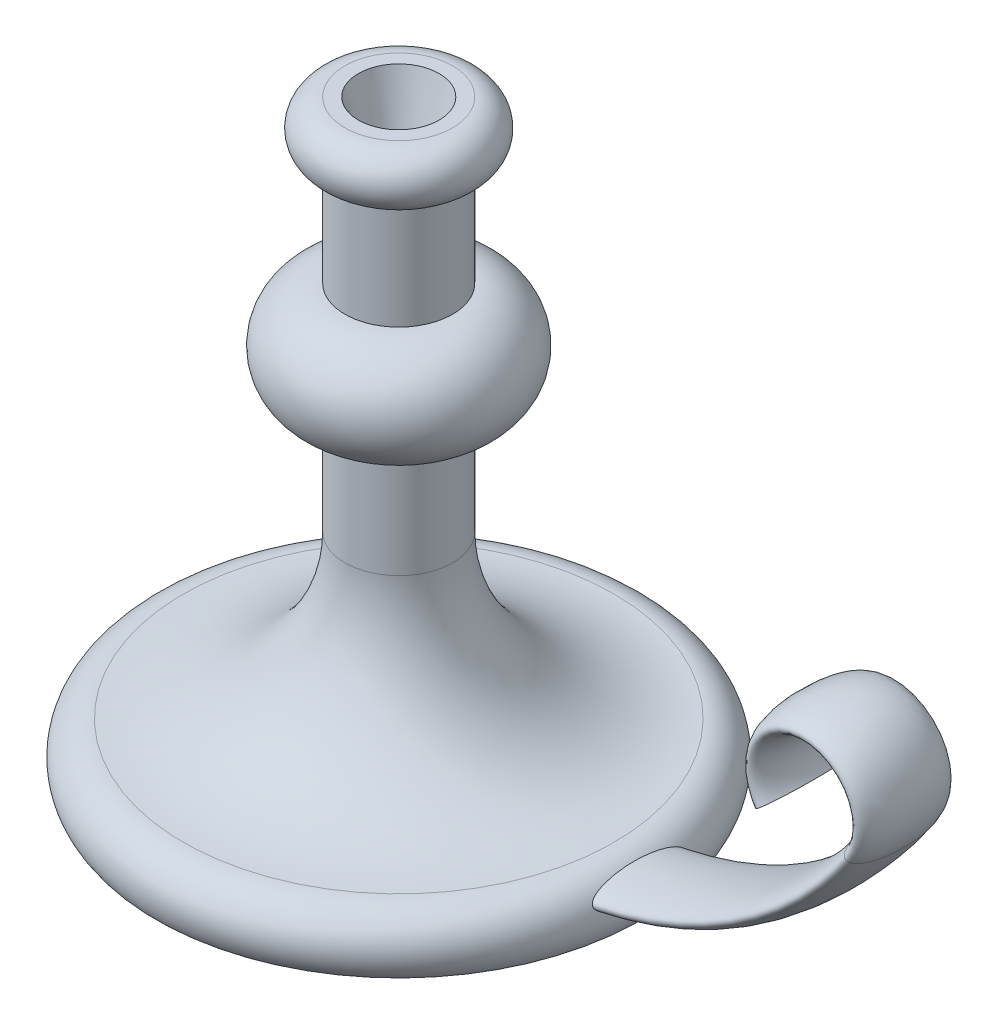
ISO-10303-21;
HEADER;
FILE_DESCRIPTION(('STEP AP214'),'2;1');
FILE_NAME('part.step','',(''),(''),'','','');
FILE_SCHEMA(('AUTOMOTIVE_DESIGN { 1 0 10303 214 1 1 1 1 }'));
ENDSEC;
DATA;
#1=APPLICATION_CONTEXT('core data for automotive mechanical design processes');
#2=APPLICATION_PROTOCOL_DEFINITION('international standard','automotive_design',2000,#1);
#3=PRODUCT_CONTEXT('',#1,'mechanical');
#4=PRODUCT('Part','Part','',(#3));
#5=PRODUCT_RELATED_PRODUCT_CATEGORY('part','',(#4));
#6=PRODUCT_DEFINITION_FORMATION('','',#4);
#7=PRODUCT_DEFINITION_CONTEXT('part definition',#1,'design');
#8=PRODUCT_DEFINITION('design','',#6,#7);
#9=PRODUCT_DEFINITION_SHAPE('','',#8);
#10=(LENGTH_UNIT() NAMED_UNIT(*) SI_UNIT(.MILLI.,.METRE.));
#11=(NAMED_UNIT(*) PLANE_ANGLE_UNIT() SI_UNIT($,.RADIAN.));
#12=(NAMED_UNIT(*) SI_UNIT($,.STERADIAN.) SOLID_ANGLE_UNIT());
#13=UNCERTAINTY_MEASURE_WITH_UNIT(LENGTH_MEASURE(1.E-05),#10,'distance_accuracy_value','');
#14=(GEOMETRIC_REPRESENTATION_CONTEXT(3) GLOBAL_UNCERTAINTY_ASSIGNED_CONTEXT((#13)) GLOBAL_UNIT_ASSIGNED_CONTEXT((#10,
#11,#12)) REPRESENTATION_CONTEXT('',''));
#15=CARTESIAN_POINT('',(0.,0.,0.));
#16=DIRECTION('',(0.,0.,1.));
#17=DIRECTION('',(1.,0.,0.));
#18=AXIS2_PLACEMENT_3D('',#15,#16,#17);
#19=CARTESIAN_POINT('',(0.,0.,0.));
#20=DIRECTION('',(0.,-1.,0.));
#21=DIRECTION('',(0.,0.,-1.));
#22=AXIS2_PLACEMENT_3D('',#19,#20,#21);
#23=PLANE('',#22);
#24=CARTESIAN_POINT('',(0.,0.,0.));
#25=DIRECTION('',(0.,-1.,0.));
#26=DIRECTION('',(0.,0.,-1.));
#27=AXIS2_PLACEMENT_3D('',#24,#25,#26);
#28=CIRCLE('',#27,90.);
#29=CARTESIAN_POINT('',(0.,0.,-90.));
#30=VERTEX_POINT('',#29);
#31=EDGE_CURVE('E65',#30,#30,#28,.T.);
#32=ORIENTED_EDGE('',*,*,#31,.T.);
#33=EDGE_LOOP('',(#32));
#34=FACE_BOUND('',#33,.T.);
#35=ADVANCED_FACE('F33',(#34),#23,.T.);
#36=CARTESIAN_POINT('',(0.,220.,0.));
#37=DIRECTION('',(0.,1.,0.));
#38=DIRECTION('',(0.,0.,1.));
#39=AXIS2_PLACEMENT_3D('',#36,#37,#38);
#40=PLANE('',#39);
#41=CARTESIAN_POINT('',(0.,220.,0.));
#42=DIRECTION('',(0.,1.,0.));
#43=DIRECTION('',(0.,0.,1.));
#44=AXIS2_PLACEMENT_3D('',#41,#42,#43);
#45=CIRCLE('',#44,15.);
#46=CARTESIAN_POINT('',(0.,220.,15.));
#47=VERTEX_POINT('',#46);
#48=EDGE_CURVE('E118',#47,#47,#45,.T.);
#49=ORIENTED_EDGE('',*,*,#48,.F.);
#50=EDGE_LOOP('',(#49));
#51=FACE_BOUND('',#50,.T.);
#52=CARTESIAN_POINT('',(0.,220.,0.));
#53=DIRECTION('',(0.,-1.,0.));
#54=DIRECTION('',(0.,0.,-1.));
#55=AXIS2_PLACEMENT_3D('',#52,#53,#54);
#56=CIRCLE('',#55,20.);
#57=CARTESIAN_POINT('',(0.,220.,-20.));
#58=VERTEX_POINT('',#57);
#59=EDGE_CURVE('E43',#58,#58,#56,.T.);
#60=ORIENTED_EDGE('',*,*,#59,.F.);
#61=EDGE_LOOP('',(#60));
#62=FACE_BOUND('',#61,.T.);
#63=ADVANCED_FACE('F108',(#51,#62),#40,.T.);
#64=CARTESIAN_POINT('',(0.,210.,0.));
#65=DIRECTION('',(0.,-1.,0.));
#66=DIRECTION('',(0.,0.,-1.));
#67=AXIS2_PLACEMENT_3D('',#64,#65,#66);
#68=TOROIDAL_SURFACE('',#67,20.,10.);
#69=ORIENTED_EDGE('',*,*,#59,.T.);
#70=EDGE_LOOP('',(#69));
#71=FACE_BOUND('',#70,.T.);
#72=CARTESIAN_POINT('',(0.,200.,0.));
#73=DIRECTION('',(0.,-1.,0.));
#74=DIRECTION('',(0.,0.,-1.));
#75=AXIS2_PLACEMENT_3D('',#72,#73,#74);
#76=CIRCLE('',#75,20.);
#77=CARTESIAN_POINT('',(0.,200.,-20.));
#78=VERTEX_POINT('',#77);
#79=EDGE_CURVE('E47',#78,#78,#76,.T.);
#80=ORIENTED_EDGE('',*,*,#79,.F.);
#81=EDGE_LOOP('',(#80));
#82=FACE_BOUND('',#81,.T.);
#83=ADVANCED_FACE('F105',(#71,#82),#68,.T.);
#84=CARTESIAN_POINT('',(0.,0.,0.));
#85=DIRECTION('',(0.,-1.,0.));
#86=DIRECTION('',(0.,0.,-1.));
#87=AXIS2_PLACEMENT_3D('',#84,#85,#86);
#88=CYLINDRICAL_SURFACE('',#87,20.);
#89=ORIENTED_EDGE('',*,*,#79,.T.);
#90=EDGE_LOOP('',(#89));
#91=FACE_BOUND('',#90,.T.);
#92=CARTESIAN_POINT('',(0.,160.,0.));
#93=DIRECTION('',(0.,-1.,0.));
#94=DIRECTION('',(0.,0.,-1.));
#95=AXIS2_PLACEMENT_3D('',#92,#93,#94);
#96=CIRCLE('',#95,20.);
#97=CARTESIAN_POINT('',(0.,160.,-20.));
#98=VERTEX_POINT('',#97);
#99=EDGE_CURVE('E51',#98,#98,#96,.T.);
#100=ORIENTED_EDGE('',*,*,#99,.F.);
#101=EDGE_LOOP('',(#100));
#102=FACE_BOUND('',#101,.T.);
#103=ADVANCED_FACE('F101',(#91,#102),#88,.T.);
#104=CARTESIAN_POINT('',(0.,140.,0.));
#105=DIRECTION('',(0.,-1.,0.));
#106=DIRECTION('',(0.,0.,-1.));
#107=AXIS2_PLACEMENT_3D('',#104,#105,#106);
#108=TOROIDAL_SURFACE('',#107,20.,20.);
#109=ORIENTED_EDGE('',*,*,#99,.T.);
#110=EDGE_LOOP('',(#109));
#111=FACE_BOUND('',#110,.T.);
#112=CARTESIAN_POINT('',(0.,120.,0.));
#113=DIRECTION('',(0.,-1.,0.));
#114=DIRECTION('',(0.,0.,-1.));
#115=AXIS2_PLACEMENT_3D('',#112,#113,#114);
#116=CIRCLE('',#115,20.);
#117=CARTESIAN_POINT('',(0.,120.,-20.));
#118=VERTEX_POINT('',#117);
#119=EDGE_CURVE('E56',#118,#118,#116,.T.);
#120=ORIENTED_EDGE('',*,*,#119,.F.);
#121=EDGE_LOOP('',(#120));
#122=FACE_BOUND('',#121,.T.);
#123=ADVANCED_FACE('F97',(#111,#122),#108,.T.);
#124=CARTESIAN_POINT('',(0.,0.,0.));
#125=DIRECTION('',(0.,-1.,0.));
#126=DIRECTION('',(0.,0.,-1.));
#127=AXIS2_PLACEMENT_3D('',#124,#125,#126);
#128=CYLINDRICAL_SURFACE('',#127,20.);
#129=ORIENTED_EDGE('',*,*,#119,.T.);
#130=EDGE_LOOP('',(#129));
#131=FACE_BOUND('',#130,.T.);
#132=CARTESIAN_POINT('',(0.,80.,0.));
#133=DIRECTION('',(0.,-1.,0.));
#134=DIRECTION('',(0.,0.,-1.));
#135=AXIS2_PLACEMENT_3D('',#132,#133,#134);
#136=CIRCLE('',#135,20.);
#137=CARTESIAN_POINT('',(0.,80.,-20.));
#138=VERTEX_POINT('',#137);
#139=EDGE_CURVE('E59',#138,#138,#136,.T.);
#140=ORIENTED_EDGE('',*,*,#139,.F.);
#141=EDGE_LOOP('',(#140));
#142=FACE_BOUND('',#141,.T.);
#143=ADVANCED_FACE('F93',(#131,#142),#128,.T.);
#144=CARTESIAN_POINT('',(0.,80.,0.));
#145=DIRECTION('',(0.,-1.,0.));
#146=DIRECTION('',(0.,0.,-1.));
#147=AXIS2_PLACEMENT_3D('',#144,#145,#146);
#148=TOROIDAL_SURFACE('',#147,80.,60.);
#149=ORIENTED_EDGE('',*,*,#139,.T.);
#150=EDGE_LOOP('',(#149));
#151=FACE_BOUND('',#150,.T.);
#152=CARTESIAN_POINT('',(0.,20.,0.));
#153=DIRECTION('',(0.,-1.,0.));
#154=DIRECTION('',(0.,0.,-1.));
#155=AXIS2_PLACEMENT_3D('',#152,#153,#154);
#156=CIRCLE('',#155,80.);
#157=CARTESIAN_POINT('',(0.,20.,-80.));
#158=VERTEX_POINT('',#157);
#159=EDGE_CURVE('E62',#158,#158,#156,.T.);
#160=ORIENTED_EDGE('',*,*,#159,.F.);
#161=EDGE_LOOP('',(#160));
#162=FACE_BOUND('',#161,.T.);
#163=ADVANCED_FACE('F89',(#151,#162),#148,.F.);
#164=CARTESIAN_POINT('',(0.,7.50000000000002,0.));
#165=DIRECTION('',(0.,-1.,0.));
#166=DIRECTION('',(0.,0.,-1.));
#167=AXIS2_PLACEMENT_3D('',#164,#165,#166);
#168=TOROIDAL_SURFACE('',#167,80.,12.5);
#169=CARTESIAN_POINT('',(89.5597422043342,12.9414346567555,-17.5));
#170=CARTESIAN_POINT('',(89.5390682417035,12.9833970763635,-17.499999801476));
#171=CARTESIAN_POINT('',(89.5184948481193,13.0254081758614,-17.4978460786372));
#172=CARTESIAN_POINT('',(89.477707455766,13.1091783719494,-17.4892930018231));
#173=CARTESIAN_POINT('',(89.4574935851385,13.1509373753177,-17.4828921640349));
#174=CARTESIAN_POINT('',(89.3975656488552,13.275424618129,-17.4575317742508));
#175=CARTESIAN_POINT('',(89.358593034799,13.3573066164348,-17.4324146791396));
#176=CARTESIAN_POINT('',(89.2734409816766,13.5379175715786,-17.3597432795598));
#177=CARTESIAN_POINT('',(89.2281121247517,13.6353143232492,-17.3079911474061));
#178=CARTESIAN_POINT('',(89.1421571121495,13.8217561384483,-17.188166079603));
#179=CARTESIAN_POINT('',(89.1015411563845,13.9107830112797,-17.1200586894138));
#180=CARTESIAN_POINT('',(89.0298762971165,14.0690143319055,-16.9825248110394));
#181=CARTESIAN_POINT('',(88.9982786842444,14.1392645151032,-16.9145529225411));
#182=CARTESIAN_POINT('',(88.937830666444,14.274320374163,-16.7722185271801));
#183=CARTESIAN_POINT('',(88.9089824882069,14.3391216321741,-16.6978509317862));
#184=CARTESIAN_POINT('',(88.8535955575885,14.4639952815646,-16.5441752211162));
#185=CARTESIAN_POINT('',(88.827062224157,14.5240565470722,-16.4648562214599));
#186=CARTESIAN_POINT('',(88.7760324990849,14.639869406975,-16.3025689169611));
#187=CARTESIAN_POINT('',(88.7515354717388,14.6956223459826,-16.2196017634807));
#188=CARTESIAN_POINT('',(88.7047417294347,14.8022966462375,-16.0524591820991));
#189=CARTESIAN_POINT('',(88.6824111309148,14.8532916472492,-15.9683399173081));
#190=CARTESIAN_POINT('',(88.639188061834,14.9520793339758,-15.7978736183899));
#191=CARTESIAN_POINT('',(88.6182958325685,14.9998714823563,-15.7115262138021));
#192=CARTESIAN_POINT('',(88.5574287556144,15.1391199588384,-15.44952020703));
#193=CARTESIAN_POINT('',(88.5193306885353,15.2262946979451,-15.2711446093401));
#194=CARTESIAN_POINT('',(88.446993084953,15.3914560839503,-14.9093240436534));
#195=CARTESIAN_POINT('',(88.4127567918464,15.469435010004,-14.7258749732314));
#196=CARTESIAN_POINT('',(88.3472362016713,15.6180770700464,-14.3544014869796));
#197=CARTESIAN_POINT('',(88.3159681826398,15.6887000486784,-14.1663582382779));
#198=CARTESIAN_POINT('',(88.2560646079385,15.8232632193263,-13.7877426015725));
#199=CARTESIAN_POINT('',(88.2274261580789,15.8872107694165,-13.5971732648847));
#200=CARTESIAN_POINT('',(88.1723521282148,16.0093779596915,-13.2139752998443));
#201=CARTESIAN_POINT('',(88.1459158137057,16.0675995109176,-13.0213473824979));
#202=CARTESIAN_POINT('',(88.0881587196921,16.1938504755766,-12.5829461756591));
#203=CARTESIAN_POINT('',(88.0574088267971,16.260370117645,-12.3366637905583));
#204=CARTESIAN_POINT('',(87.9985123187222,16.3864590847677,-11.842004819733));
#205=CARTESIAN_POINT('',(87.970365975028,16.4460276851698,-11.5936280185527));
#206=CARTESIAN_POINT('',(87.916348258683,16.559094633045,-11.094931062254));
#207=CARTESIAN_POINT('',(87.8904797303634,16.6125854146131,-10.8446088905713));
#208=CARTESIAN_POINT('',(87.8408483965671,16.7140512465656,-10.3426370646258));
#209=CARTESIAN_POINT('',(87.8170856939001,16.7620260276843,-10.0909873461849));
#210=CARTESIAN_POINT('',(87.7486691228053,16.8985839230831,-9.33377768592057));
#211=CARTESIAN_POINT('',(87.7069540377654,16.9796608720202,-8.82658708533015));
#212=CARTESIAN_POINT('',(87.6306961124076,17.1248455016837,-7.80916406760127));
#213=CARTESIAN_POINT('',(87.5961551600075,17.1889487168834,-7.2989308860361));
#214=CARTESIAN_POINT('',(87.5339911377834,17.3022548727762,-6.2755853599665));
#215=CARTESIAN_POINT('',(87.5063790759953,17.3514341291622,-5.76246974165422));
#216=CARTESIAN_POINT('',(87.4581556376937,17.4361006629321,-4.73533825840212));
#217=CARTESIAN_POINT('',(87.4375369377591,17.4716022688271,-4.22132390532691));
#218=CARTESIAN_POINT('',(87.4033485965417,17.5298933049628,-3.1926320356417));
#219=CARTESIAN_POINT('',(87.3897750436296,17.5526897899014,-2.67795504642718));
#220=CARTESIAN_POINT('',(87.3697503063744,17.5861573346741,-1.64816415678594));
#221=CARTESIAN_POINT('',(87.3632979000102,17.5968304749383,-1.13305034650782));
#222=CARTESIAN_POINT('',(87.3567446403377,17.60768667733,0.0451925107309963));
#223=CARTESIAN_POINT('',(87.3589979794371,17.6039802512046,0.708375187513497));
#224=CARTESIAN_POINT('',(87.375360353613,17.5767998431173,2.03444017536875));
#225=CARTESIAN_POINT('',(87.3894738801436,17.5533183723369,2.69732227744637));
#226=CARTESIAN_POINT('',(87.4294012787109,17.4856044911543,4.0220769358051));
#227=CARTESIAN_POINT('',(87.4552221149227,17.4413597290139,4.68394865558017));
#228=CARTESIAN_POINT('',(87.5182601373715,17.3304493690437,6.00273083681873));
#229=CARTESIAN_POINT('',(87.5554327085336,17.2638714468586,6.65965058375402));
#230=CARTESIAN_POINT('',(87.6198336832519,17.1447808230944,7.6419645780714));
#231=CARTESIAN_POINT('',(87.6427357061842,17.1018902548717,7.96882803392476));
#232=CARTESIAN_POINT('',(87.6915021526186,17.0091104096814,8.62133363379401));
#233=CARTESIAN_POINT('',(87.7173664470653,16.9592214375874,8.94697583037783));
#234=CARTESIAN_POINT('',(87.7721755297609,16.8517641144645,9.59646350792419));
#235=CARTESIAN_POINT('',(87.8011178051597,16.7942020181559,9.92031023084913));
#236=CARTESIAN_POINT('',(87.8623401784718,16.670424389,10.566015158272));
#237=CARTESIAN_POINT('',(87.8946200133661,16.6042095379317,10.8878735173494));
#238=CARTESIAN_POINT('',(87.9634236652185,16.4608004427521,11.5338084513011));
#239=CARTESIAN_POINT('',(88.0000038204032,16.3834565668023,11.8578460140796));
#240=CARTESIAN_POINT('',(88.0776704479079,16.2167402960611,12.5024294932679));
#241=CARTESIAN_POINT('',(88.1187582871156,16.1273642508179,12.8229743179847));
#242=CARTESIAN_POINT('',(88.1845991136115,15.9822640377112,13.3001792679786));
#243=CARTESIAN_POINT('',(88.2072711562738,15.9320048353495,13.458794776366));
#244=CARTESIAN_POINT('',(88.2542087743505,15.8273740345265,13.7744208617839));
#245=CARTESIAN_POINT('',(88.2784742329896,15.7730027373804,13.9314315554526));
#246=CARTESIAN_POINT('',(88.3288329339647,15.6596363065341,14.2433947335169));
#247=CARTESIAN_POINT('',(88.3549252454499,15.6006435258595,14.39834821894));
#248=CARTESIAN_POINT('',(88.4092696388298,15.4773352517477,14.7057236901227));
#249=CARTESIAN_POINT('',(88.4375213946571,15.4130205617769,14.8581460538574));
#250=CARTESIAN_POINT('',(88.4968507719838,15.2776562950139,15.1609091928641));
#251=CARTESIAN_POINT('',(88.5279487218456,15.2065580859208,15.3112244481845));
#252=CARTESIAN_POINT('',(88.5933850994804,15.0568677679762,15.6074204461967));
#253=CARTESIAN_POINT('',(88.6277241675822,14.9782741782739,15.7533003050547));
#254=CARTESIAN_POINT('',(88.7002441190653,14.8125407512939,16.0379741363754));
#255=CARTESIAN_POINT('',(88.7383996400969,14.7254574196196,16.1768067090656));
#256=CARTESIAN_POINT('',(88.7994889081869,14.5866042208345,16.3782369433215));
#257=CARTESIAN_POINT('',(88.8204977413197,14.5389415031663,16.4442523217256));
#258=CARTESIAN_POINT('',(88.8639845053437,14.4405581400326,16.57344963874));
#259=CARTESIAN_POINT('',(88.8864621846815,14.3898380182901,16.636632059411));
#260=CARTESIAN_POINT('',(88.9422432981284,14.2644224068533,16.7835876842853));
#261=CARTESIAN_POINT('',(88.9763364041361,14.1881224618925,16.8657235531464));
#262=CARTESIAN_POINT('',(89.0483213192219,14.0281384901655,17.0203903295081));
#263=CARTESIAN_POINT('',(89.0862061390434,13.9444680822868,17.0929383574397));
#264=CARTESIAN_POINT('',(89.167031158356,13.7675914637829,17.2256585134364));
#265=CARTESIAN_POINT('',(89.2100345714228,13.6742683967974,17.2856436508903));
#266=CARTESIAN_POINT('',(89.2779863638654,13.5285260537469,17.3610498966371));
#267=CARTESIAN_POINT('',(89.3011904906555,13.4790295981995,17.3837437830228));
#268=CARTESIAN_POINT('',(89.348681122482,13.3783655416218,17.4235815208145));
#269=CARTESIAN_POINT('',(89.3729671592224,13.3271986661329,17.4407277474299));
#270=CARTESIAN_POINT('',(89.4344831171652,13.1984825422767,17.4755813984572));
#271=CARTESIAN_POINT('',(89.4722908092759,13.1201458143824,17.4895469950748));
#272=CARTESIAN_POINT('',(89.5490629639974,12.9628453353438,17.5023227338008));
#273=CARTESIAN_POINT('',(89.5880269032797,12.8838818793689,17.5011396310453));
#274=CARTESIAN_POINT('',(89.6659197904111,12.7278461407132,17.4839019863865));
#275=CARTESIAN_POINT('',(89.7048486189822,12.6507699944114,17.4678809909871));
#276=CARTESIAN_POINT('',(89.7818193498578,12.5001197626227,17.4227133423485));
#277=CARTESIAN_POINT('',(89.8198603575275,12.4265491378842,17.393554003752));
#278=CARTESIAN_POINT('',(89.9134049221881,12.2476534190935,17.3068893145741));
#279=CARTESIAN_POINT('',(89.9679590616014,12.145189839,17.2425093702032));
#280=CARTESIAN_POINT('',(90.0730473029299,11.9508453333027,17.0967607254912));
#281=CARTESIAN_POINT('',(90.1235693401402,11.8589958245569,17.0153434992559));
#282=CARTESIAN_POINT('',(90.2171397045065,11.6912868202041,16.8474453840373));
#283=CARTESIAN_POINT('',(90.2604644261217,11.6147475285805,16.7617815283372));
#284=CARTESIAN_POINT('',(90.344182781737,11.4686468553497,16.5833011975358));
#285=CARTESIAN_POINT('',(90.3845736709566,11.3990919854158,16.4904781877927));
#286=CARTESIAN_POINT('',(90.4628381757603,11.2658377500077,16.2994188011804));
#287=CARTESIAN_POINT('',(90.500706012981,11.2021517058673,16.2011708808851));
#288=CARTESIAN_POINT('',(90.5741373771332,11.0799532151566,16.0007631564048));
#289=CARTESIAN_POINT('',(90.6097017753878,11.0214388092179,15.8986048549431));
#290=CARTESIAN_POINT('',(90.6798506810756,10.9071528014044,15.6881130904041));
#291=CARTESIAN_POINT('',(90.7143737156138,10.8515162836077,15.5796863139986));
#292=CARTESIAN_POINT('',(90.781526854715,10.7443116806204,15.3602532814347));
#293=CARTESIAN_POINT('',(90.8141566222384,10.6927443192367,15.2492465708925));
#294=CARTESIAN_POINT('',(90.8777648134717,10.5931040659528,15.0249916383676));
#295=CARTESIAN_POINT('',(90.9087405253397,10.5450368683676,14.9117401290225));
#296=CARTESIAN_POINT('',(90.9691471982793,10.4520756013828,14.6835311743097));
#297=CARTESIAN_POINT('',(90.9985780215572,10.4071818149066,14.5685735779396));
#298=CARTESIAN_POINT('',(91.0847991405954,10.2766779068817,14.2214202083284));
#299=CARTESIAN_POINT('',(91.1394751820611,10.1953120661678,13.9870973298015));
#300=CARTESIAN_POINT('',(91.2442711007081,10.0414382528768,13.5131955707522));
#301=CARTESIAN_POINT('',(91.2943656433969,9.96897885186307,13.2735956051686));
#302=CARTESIAN_POINT('',(91.3902100238879,9.83200733703218,12.79159196713));
#303=CARTESIAN_POINT('',(91.4359646930145,9.76748636147265,12.5491917575653));
#304=CARTESIAN_POINT('',(91.5236096481364,9.64522219888428,12.0620925005215));
#305=CARTESIAN_POINT('',(91.5655011282609,9.58747691594505,11.817394189339));
#306=CARTESIAN_POINT('',(91.6521116126998,9.4692402793352,11.2872469347066));
#307=CARTESIAN_POINT('',(91.6962295705011,9.40975960214712,11.0014751279473));
#308=CARTESIAN_POINT('',(91.7801283472624,9.29775188889531,10.4279264531641));
#309=CARTESIAN_POINT('',(91.8199088096836,9.24522542438707,10.1401494223776));
#310=CARTESIAN_POINT('',(91.8954614399622,9.14632559185101,9.56268010524018));
#311=CARTESIAN_POINT('',(91.9312290206064,9.09995925467446,9.27298601993951));
#312=CARTESIAN_POINT('',(91.9989276864042,9.01286744655934,8.69230014878685));
#313=CARTESIAN_POINT('',(92.0308586021366,8.97214222471179,8.40130830621588));
#314=CARTESIAN_POINT('',(92.1212362536797,8.85762649139713,7.52609730454289));
#315=CARTESIAN_POINT('',(92.1741858932312,8.7916021483054,6.94027690543012));
#316=CARTESIAN_POINT('',(92.2664432393134,8.67757998740731,5.76570323769234));
#317=CARTESIAN_POINT('',(92.3057471215827,8.62958722269171,5.17694919372191));
#318=CARTESIAN_POINT('',(92.3712614806833,8.55005786852789,3.9984626776462));
#319=CARTESIAN_POINT('',(92.3974906208571,8.51849781956404,3.40873281276931));
#320=CARTESIAN_POINT('',(92.4372887662618,8.47075403181993,2.2287671311231));
#321=CARTESIAN_POINT('',(92.4508691565616,8.45455646511476,1.6385322489075));
#322=CARTESIAN_POINT('',(92.4655827970144,8.43701196328774,0.458012213446585));
#323=CARTESIAN_POINT('',(92.4667228078028,8.43565696207802,-0.132272738146401));
#324=CARTESIAN_POINT('',(92.4565896588575,8.44773292337775,-1.31245514854756));
#325=CARTESIAN_POINT('',(92.4453194307794,8.46116039384158,-1.90235266594689));
#326=CARTESIAN_POINT('',(92.4152323530397,8.49720127894516,-2.91293122103729));
#327=CARTESIAN_POINT('',(92.399488633902,8.5160977132729,-3.33384169728235));
#328=CARTESIAN_POINT('',(92.3614792935747,8.56194763892485,-4.17492724051919));
#329=CARTESIAN_POINT('',(92.3392138048888,8.58890096655603,-4.59510232227765));
#330=CARTESIAN_POINT('',(92.2880200589734,8.6512809200387,-5.43403090747417));
#331=CARTESIAN_POINT('',(92.2590979156981,8.68669977168038,-5.85278535976624));
#332=CARTESIAN_POINT('',(92.1943469782254,8.76665027127174,-6.68888197530243));
#333=CARTESIAN_POINT('',(92.1585184884691,8.81118151754008,-7.10622419997458));
#334=CARTESIAN_POINT('',(92.0913883463787,8.89546537402934,-7.81486574096269));
#335=CARTESIAN_POINT('',(92.0619223972662,8.93268360128545,-8.10664239637744));
#336=CARTESIAN_POINT('',(91.9992751831063,9.01244031978378,-8.68906573698728));
#337=CARTESIAN_POINT('',(91.9660940114555,9.05497867728702,-8.97971245039788));
#338=CARTESIAN_POINT('',(91.8958362735746,9.1458607932075,-9.55954014430441));
#339=CARTESIAN_POINT('',(91.8587608402588,9.19420286379702,-9.84872152557169));
#340=CARTESIAN_POINT('',(91.7804640728037,9.29733424331398,-10.4253680209642));
#341=CARTESIAN_POINT('',(91.7392428979817,9.35212330450291,-10.7128332005922));
#342=CARTESIAN_POINT('',(91.6651852642288,9.45169652539594,-11.2009114295785));
#343=CARTESIAN_POINT('',(91.6334740038737,9.49464812309783,-11.4020698755101));
#344=CARTESIAN_POINT('',(91.5676939042956,9.58452467571581,-11.8031075357918));
#345=CARTESIAN_POINT('',(91.5336251409561,9.63144950275206,-12.0029867910907));
#346=CARTESIAN_POINT('',(91.4629103530476,9.72978070272852,-12.4014607237168));
#347=CARTESIAN_POINT('',(91.4262611401134,9.78119263934334,-12.6000534686612));
#348=CARTESIAN_POINT('',(91.3502044219463,9.88900570640472,-12.9953470629622));
#349=CARTESIAN_POINT('',(91.3107970144953,9.94540666000194,-13.1920479791059));
#350=CARTESIAN_POINT('',(91.2276212473531,10.0658223958309,-13.5894074367473));
#351=CARTESIAN_POINT('',(91.1837532035468,10.1300241281594,-13.7899888884084));
#352=CARTESIAN_POINT('',(91.0923799134056,10.2655141547625,-14.1878967143447));
#353=CARTESIAN_POINT('',(91.0448751095645,10.3368015872161,-14.3852234810858));
#354=CARTESIAN_POINT('',(90.9457925667077,10.4876709266022,-14.7751386376011));
#355=CARTESIAN_POINT('',(90.8942241714188,10.5672339324146,-14.9677366350335));
#356=CARTESIAN_POINT('',(90.7862143447504,10.7366119201245,-15.346898208625));
#357=CARTESIAN_POINT('',(90.729775697936,10.8264210531393,-15.5334651502503));
#358=CARTESIAN_POINT('',(90.6212033814548,11.0023988323086,-15.8665064968249));
#359=CARTESIAN_POINT('',(90.5700064097145,11.0865232525121,-16.0143454854332));
#360=CARTESIAN_POINT('',(90.489494836857,11.2210719601952,-16.2297682662972));
#361=CARTESIAN_POINT('',(90.4620005609573,11.2673801193659,-16.3006068507203));
#362=CARTESIAN_POINT('',(90.405663881725,11.363102721514,-16.4395882553711));
#363=CARTESIAN_POINT('',(90.376821791941,11.4125164429424,-16.50773169584));
#364=CARTESIAN_POINT('',(90.3173000187957,11.5154431106472,-16.6414688232469));
#365=CARTESIAN_POINT('',(90.2866026931881,11.5689974830644,-16.7070230259515));
#366=CARTESIAN_POINT('',(90.2235248416842,11.6801460587692,-16.8338288983819));
#367=CARTESIAN_POINT('',(90.1911437589228,11.7377416008125,-16.895079128713));
#368=CARTESIAN_POINT('',(90.1246746009051,11.8572287345103,-17.0118342639399));
#369=CARTESIAN_POINT('',(90.0905922975461,11.9191060427893,-17.0673568649592));
#370=CARTESIAN_POINT('',(90.0205945500714,12.0476162041313,-17.1711750807903));
#371=CARTESIAN_POINT('',(89.9846810936558,12.1142439306956,-17.2194783172374));
#372=CARTESIAN_POINT('',(89.9072691914907,12.2595601926768,-17.3112578352747));
#373=CARTESIAN_POINT('',(89.865573443312,12.3387868393087,-17.3537501287488));
#374=CARTESIAN_POINT('',(89.8018195982617,12.4615624088595,-17.4064482222615));
#375=CARTESIAN_POINT('',(89.78038597328,12.5031053112504,-17.4221652201551));
#376=CARTESIAN_POINT('',(89.7372110357347,12.5873443591989,-17.4495428289002));
#377=CARTESIAN_POINT('',(89.715469865874,12.6300399777376,-17.4612052607452));
#378=CARTESIAN_POINT('',(89.6713740740665,12.717210960288,-17.4803130763978));
#379=CARTESIAN_POINT('',(89.6490160377543,12.7617048684931,-17.4876666954989));
#380=CARTESIAN_POINT('',(89.6043139799334,12.8512585298285,-17.4975110322341));
#381=CARTESIAN_POINT('',(89.5819699650801,12.8963184572137,-17.5000002134445));
#382=CARTESIAN_POINT('',(89.5597422043342,12.9414346567555,-17.5));
#383=B_SPLINE_CURVE_WITH_KNOTS('',3,(#169,#170,#171,#172,#173,#174,#175,#176,#177,#178,#179,
#180,#181,#182,#183,#184,#185,#186,#187,#188,#189,#190,#191,#192,#193,#194,#195,#196,#197,#198,
#199,#200,#201,#202,#203,#204,#205,#206,#207,#208,#209,#210,#211,#212,#213,#214,#215,#216,#217,
#218,#219,#220,#221,#222,#223,#224,#225,#226,#227,#228,#229,#230,#231,#232,#233,#234,#235,#236,
#237,#238,#239,#240,#241,#242,#243,#244,#245,#246,#247,#248,#249,#250,#251,#252,#253,#254,#255,
#256,#257,#258,#259,#260,#261,#262,#263,#264,#265,#266,#267,#268,#269,#270,#271,#272,#273,#274,
#275,#276,#277,#278,#279,#280,#281,#282,#283,#284,#285,#286,#287,#288,#289,#290,#291,#292,#293,
#294,#295,#296,#297,#298,#299,#300,#301,#302,#303,#304,#305,#306,#307,#308,#309,#310,#311,#312,
#313,#314,#315,#316,#317,#318,#319,#320,#321,#322,#323,#324,#325,#326,#327,#328,#329,#330,#331,
#332,#333,#334,#335,#336,#337,#338,#339,#340,#341,#342,#343,#344,#345,#346,#347,#348,#349,#350,
#351,#352,#353,#354,#355,#356,#357,#358,#359,#360,#361,#362,#363,#364,#365,#366,#367,#368,#369,
#370,#371,#372,#373,#374,#375,#376,#377,#378,#379,#380,#381,#382),.UNSPECIFIED.,.T.,.F.,(4,2,2,
2,2,2,2,2,2,2,2,2,2,2,2,2,2,2,2,2,2,2,2,2,2,2,2,2,2,2,2,2,2,2,2,2,2,2,2,2,2,2,2,2,2,2,2,2,2,2,2,
2,2,2,2,2,2,2,2,2,2,2,2,2,2,2,2,2,2,2,2,2,2,2,2,2,2,2,2,2,2,2,2,2,2,2,2,2,2,2,2,2,2,2,2,2,2,2,2,
2,2,2,2,2,2,2,4),(0.,0.140282110016988,0.280613256161179,0.561461564225122,0.917223769341695,
1.27374211332868,1.58149644875512,1.88949794489936,2.19820212539504,2.50680956807613,
2.80932632770101,3.11189371339087,3.71792129086061,4.32445412269163,4.93414127512148,
5.54314913395225,6.15195304286655,6.92267401303089,7.69347525989552,8.46522575436397,
9.23701390615444,10.782534460902,12.3284612151258,13.8768286753821,15.4235696486731,
16.9694509143284,18.5150668584834,20.5042466673049,22.4941801183611,24.4852988514029,
26.4686905809743,27.459998906525,28.4512640608192,29.4417260743116,30.4321100930467,
31.4373321749631,32.4428599224087,32.946583569266,33.4502703412871,33.9537023077347,
34.4570584075532,34.9643418345013,35.4717256930964,35.9759372580731,36.2281107568737,
36.4802411813,36.8312072460144,37.181537891104,37.5367612141431,37.7140754934857,37.89131375563,
38.1543004158639,38.4171698086856,38.6794463357425,38.9419766409756,39.3379141865755,
39.7349951838558,40.102773906583,40.4708923916061,40.839826864643,41.2086209555952,
41.5884869463044,41.9684203545958,42.3489586608922,42.7295308511683,43.4911928834882,
44.256839923957,45.0216243573454,45.7861715944572,46.6716652705939,47.5572316789029,
48.4438002995174,49.3304080552897,51.1055666497459,52.8812223365027,54.6543360799662,
56.4258523069851,58.1964057681728,59.9665410633642,61.2313114731962,62.4960561882575,
63.7596438732329,65.0231758702889,65.9099510809564,66.7967040040929,67.6831996648505,
68.5696612713581,69.1939827802151,69.8182842026875,70.4433710180117,71.068435684298,
71.7136688505262,72.3588236339987,73.0025359817189,73.6458826951298,74.1782561728135,
74.4451297056834,74.7119414605322,74.9818957428949,75.2519398816414,75.5211229919271,
75.7900198815156,76.0861439670073,76.233946529996,76.381682625628,76.5324603376654,
76.68328566487),.UNSPECIFIED.);
#384=CARTESIAN_POINT('',(89.5597422043342,12.9414346567555,-17.5));
#385=VERTEX_POINT('',#384);
#386=EDGE_CURVE('E10',#385,#385,#383,.T.);
#387=ORIENTED_EDGE('',*,*,#386,.F.);
#388=EDGE_LOOP('',(#387));
#389=FACE_BOUND('',#388,.T.);
#390=ORIENTED_EDGE('',*,*,#159,.T.);
#391=EDGE_LOOP('',(#390));
#392=FACE_BOUND('',#391,.T.);
#393=ORIENTED_EDGE('',*,*,#31,.F.);
#394=EDGE_LOOP('',(#393));
#395=FACE_BOUND('',#394,.T.);
#396=ADVANCED_FACE('F82',(#389,#392,#395),#168,.T.);
#397=CARTESIAN_POINT('',(183.592070943083,75.,0.));
#398=DIRECTION('',(0.566666666666667,0.823947139620551,0.));
#399=DIRECTION('',(0.,0.,-1.));
#400=AXIS2_PLACEMENT_3D('',#397,#398,#399);
#401=ELLIPSE('',#400,17.5,5.);
#402=CARTESIAN_POINT('',(167.113128150672,86.3333333333333,0.));
#403=DIRECTION('',(0.,0.,1.));
#404=AXIS1_PLACEMENT('',#402,#403);
#405=SURFACE_OF_REVOLUTION('',#401,#404);
#406=CARTESIAN_POINT('',(183.592070943083,75.,-17.5));
#407=VERTEX_POINT('',#406);
#408=EDGE_CURVE('E71',#407,#407,#401,.T.);
#409=ORIENTED_EDGE('',*,*,#408,.T.);
#410=EDGE_LOOP('',(#409));
#411=FACE_BOUND('',#410,.T.);
#412=CARTESIAN_POINT('',(150.634185358261,74.9999999999998,0.));
#413=DIRECTION('',(0.566666666666679,-0.823947139620543,0.));
#414=DIRECTION('',(0.,0.,-1.));
#415=AXIS2_PLACEMENT_3D('',#412,#413,#414);
#416=ELLIPSE('',#415,17.5,5.);
#417=CARTESIAN_POINT('',(150.634185358261,74.9999999999998,-17.5));
#418=VERTEX_POINT('',#417);
#419=EDGE_CURVE('E68',#418,#418,#416,.T.);
#420=ORIENTED_EDGE('',*,*,#419,.F.);
#421=EDGE_LOOP('',(#420));
#422=FACE_BOUND('',#421,.T.);
#423=ADVANCED_FACE('F79',(#411,#422),#405,.F.);
#424=CARTESIAN_POINT('',(60.,10.,0.));
#425=DIRECTION('',(1.,0.,0.));
#426=DIRECTION('',(0.,0.,-1.));
#427=AXIS2_PLACEMENT_3D('',#424,#425,#426);
#428=ELLIPSE('',#427,17.5,5.);
#429=CARTESIAN_POINT('',(60.,160.,0.));
#430=DIRECTION('',(0.,0.,1.));
#431=AXIS1_PLACEMENT('',#429,#430);
#432=SURFACE_OF_REVOLUTION('',#428,#431);
#433=ORIENTED_EDGE('',*,*,#386,.T.);
#434=EDGE_LOOP('',(#433));
#435=FACE_BOUND('',#434,.T.);
#436=ORIENTED_EDGE('',*,*,#408,.F.);
#437=EDGE_LOOP('',(#436));
#438=FACE_BOUND('',#437,.T.);
#439=ADVANCED_FACE('F81',(#435,#438),#432,.F.);
#440=CARTESIAN_POINT('',(150.634185358261,74.9999999999998,0.));
#441=DIRECTION('',(0.566666666666679,-0.823947139620543,0.));
#442=DIRECTION('',(0.,0.,-1.));
#443=AXIS2_PLACEMENT_3D('',#440,#441,#442);
#444=PLANE('',#443);
#445=ORIENTED_EDGE('',*,*,#419,.T.);
#446=EDGE_LOOP('',(#445));
#447=FACE_BOUND('',#446,.T.);
#448=ADVANCED_FACE('F128',(#447),#444,.T.);
#449=CARTESIAN_POINT('',(0.,220.,0.));
#450=DIRECTION('',(0.,1.,0.));
#451=DIRECTION('',(0.,0.,1.));
#452=AXIS2_PLACEMENT_3D('',#449,#450,#451);
#453=CONICAL_SURFACE('',#452,15.,0.26179938779915);
#454=CARTESIAN_POINT('',(0.,195.,0.));
#455=DIRECTION('',(0.,1.,0.));
#456=DIRECTION('',(0.,0.,1.));
#457=AXIS2_PLACEMENT_3D('',#454,#455,#456);
#458=CIRCLE('',#457,8.30127018922192);
#459=CARTESIAN_POINT('',(0.,195.,8.30127018922192));
#460=VERTEX_POINT('',#459);
#461=EDGE_CURVE('E75',#460,#460,#458,.T.);
#462=ORIENTED_EDGE('',*,*,#461,.F.);
#463=EDGE_LOOP('',(#462));
#464=FACE_BOUND('',#463,.T.);
#465=ORIENTED_EDGE('',*,*,#48,.T.);
#466=EDGE_LOOP('',(#465));
#467=FACE_BOUND('',#466,.T.);
#468=ADVANCED_FACE('F126',(#464,#467),#453,.F.);
#469=CARTESIAN_POINT('',(0.,195.,0.));
#470=DIRECTION('',(0.,1.,0.));
#471=DIRECTION('',(0.,0.,1.));
#472=AXIS2_PLACEMENT_3D('',#469,#470,#471);
#473=PLANE('',#472);
#474=ORIENTED_EDGE('',*,*,#461,.T.);
#475=EDGE_LOOP('',(#474));
#476=FACE_BOUND('',#475,.T.);
#477=ADVANCED_FACE('F124',(#476),#473,.T.);
#478=CLOSED_SHELL('',(#35,#63,#83,#103,#123,#143,#163,#396,#423,#439,#448,#468,#477));
#479=MANIFOLD_SOLID_BREP('B2',#478);
#480=ADVANCED_BREP_SHAPE_REPRESENTATION('',(#18,#479),#14);
#481=SHAPE_DEFINITION_REPRESENTATION(#9,#480);
ENDSEC;
END-ISO-10303-21;
